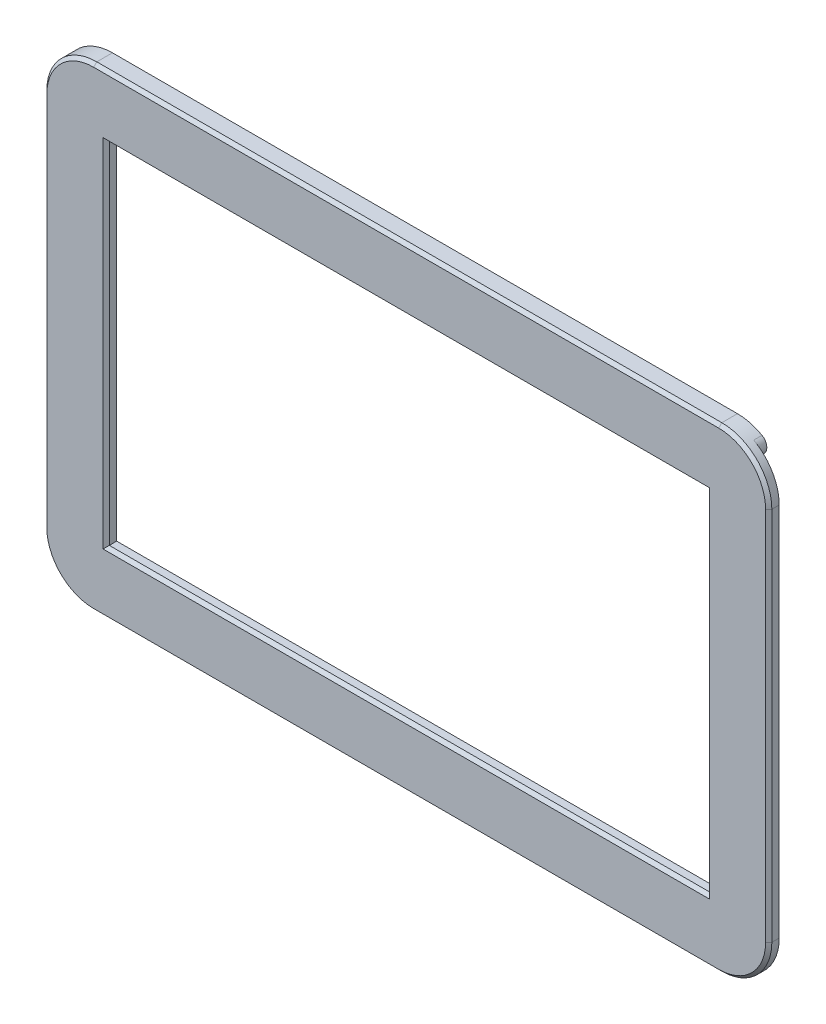
ISO-10303-21;
HEADER;
FILE_DESCRIPTION(('STEP AP214'),'2;1');
FILE_NAME('part.step','',(''),(''),'','','');
FILE_SCHEMA(('AUTOMOTIVE_DESIGN { 1 0 10303 214 1 1 1 1 }'));
ENDSEC;
DATA;
#1=APPLICATION_CONTEXT('core data for automotive mechanical design processes');
#2=APPLICATION_PROTOCOL_DEFINITION('international standard','automotive_design',2000,#1);
#3=PRODUCT_CONTEXT('',#1,'mechanical');
#4=PRODUCT('Part','Part','',(#3));
#5=PRODUCT_RELATED_PRODUCT_CATEGORY('part','',(#4));
#6=PRODUCT_DEFINITION_FORMATION('','',#4);
#7=PRODUCT_DEFINITION_CONTEXT('part definition',#1,'design');
#8=PRODUCT_DEFINITION('design','',#6,#7);
#9=PRODUCT_DEFINITION_SHAPE('','',#8);
#10=(LENGTH_UNIT() NAMED_UNIT(*) SI_UNIT(.MILLI.,.METRE.));
#11=(NAMED_UNIT(*) PLANE_ANGLE_UNIT() SI_UNIT($,.RADIAN.));
#12=(NAMED_UNIT(*) SI_UNIT($,.STERADIAN.) SOLID_ANGLE_UNIT());
#13=UNCERTAINTY_MEASURE_WITH_UNIT(LENGTH_MEASURE(1.E-05),#10,'distance_accuracy_value','');
#14=(GEOMETRIC_REPRESENTATION_CONTEXT(3) GLOBAL_UNCERTAINTY_ASSIGNED_CONTEXT((#13)) GLOBAL_UNIT_ASSIGNED_CONTEXT((#10,
#11,#12)) REPRESENTATION_CONTEXT('',''));
#15=CARTESIAN_POINT('',(0.,0.,0.));
#16=DIRECTION('',(0.,0.,1.));
#17=DIRECTION('',(1.,0.,0.));
#18=AXIS2_PLACEMENT_3D('',#15,#16,#17);
#19=CARTESIAN_POINT('',(39.6875,-23.8125,2.38125));
#20=DIRECTION('',(0.,0.,-1.));
#21=DIRECTION('',(-1.,0.,0.));
#22=AXIS2_PLACEMENT_3D('',#19,#20,#21);
#23=CYLINDRICAL_SURFACE('',#22,6.35);
#24=DIRECTION('',(0.,0.,-1.));
#25=VECTOR('',#24,1.);
#26=CARTESIAN_POINT('',(46.0375,-23.8125,2.38125));
#27=LINE('',#26,#25);
#28=CARTESIAN_POINT('',(46.0375,-23.8125,1.984375));
#29=VERTEX_POINT('',#28);
#30=CARTESIAN_POINT('',(46.0375,-23.8125,1.04775));
#31=VERTEX_POINT('',#30);
#32=EDGE_CURVE('E622',#29,#31,#27,.T.);
#33=ORIENTED_EDGE('',*,*,#32,.F.);
#34=CARTESIAN_POINT('',(39.6875,-23.8125,1.984375));
#35=DIRECTION('',(0.,0.,1.));
#36=DIRECTION('',(1.,0.,0.));
#37=AXIS2_PLACEMENT_3D('',#34,#35,#36);
#38=CIRCLE('',#37,6.35);
#39=CARTESIAN_POINT('',(39.6875,-30.1625,1.984375));
#40=VERTEX_POINT('',#39);
#41=EDGE_CURVE('E359',#29,#40,#38,.F.);
#42=ORIENTED_EDGE('',*,*,#41,.T.);
#43=DIRECTION('',(0.,0.,-1.));
#44=VECTOR('',#43,1.);
#45=CARTESIAN_POINT('',(39.6875,-30.1625,2.38125));
#46=LINE('',#45,#44);
#47=CARTESIAN_POINT('',(39.6875,-30.1625,0.));
#48=VERTEX_POINT('',#47);
#49=EDGE_CURVE('E625',#40,#48,#46,.T.);
#50=ORIENTED_EDGE('',*,*,#49,.T.);
#51=CARTESIAN_POINT('',(39.6875,-23.8125,0.));
#52=DIRECTION('',(0.,0.,1.));
#53=DIRECTION('',(0.,-1.,0.));
#54=AXIS2_PLACEMENT_3D('',#51,#52,#53);
#55=CIRCLE('',#54,6.35);
#56=CARTESIAN_POINT('',(42.8097437084808,-29.3418846153846,0.));
#57=VERTEX_POINT('',#56);
#58=EDGE_CURVE('E610',#48,#57,#55,.T.);
#59=ORIENTED_EDGE('',*,*,#58,.T.);
#60=DIRECTION('',(0.,0.,-1.));
#61=VECTOR('',#60,1.);
#62=CARTESIAN_POINT('',(42.8097437084808,-29.3418846153846,2.38125));
#63=LINE('',#62,#61);
#64=CARTESIAN_POINT('',(42.8097437084808,-29.3418846153846,1.04775));
#65=VERTEX_POINT('',#64);
#66=EDGE_CURVE('E293',#57,#65,#63,.F.);
#67=ORIENTED_EDGE('',*,*,#66,.T.);
#68=CARTESIAN_POINT('',(39.6875,-23.8125,1.04775));
#69=DIRECTION('',(0.,0.,-1.));
#70=DIRECTION('',(-1.,0.,0.));
#71=AXIS2_PLACEMENT_3D('',#68,#69,#70);
#72=CIRCLE('',#71,6.35);
#73=EDGE_CURVE('E590',#31,#65,#72,.T.);
#74=ORIENTED_EDGE('',*,*,#73,.F.);
#75=EDGE_LOOP('',(#33,#42,#50,#59,#67,#74));
#76=FACE_BOUND('',#75,.T.);
#77=ADVANCED_FACE('F16',(#76),#23,.T.);
#78=CARTESIAN_POINT('',(39.6875,23.8125,2.38125));
#79=DIRECTION('',(0.,0.,-1.));
#80=DIRECTION('',(-1.,0.,0.));
#81=AXIS2_PLACEMENT_3D('',#78,#79,#80);
#82=CYLINDRICAL_SURFACE('',#81,6.35);
#83=DIRECTION('',(0.,0.,-1.));
#84=VECTOR('',#83,1.);
#85=CARTESIAN_POINT('',(39.6875,30.1625,2.38125));
#86=LINE('',#85,#84);
#87=CARTESIAN_POINT('',(39.6875,30.1625,1.984375));
#88=VERTEX_POINT('',#87);
#89=CARTESIAN_POINT('',(39.6875,30.1625,0.));
#90=VERTEX_POINT('',#89);
#91=EDGE_CURVE('E618',#88,#90,#86,.T.);
#92=ORIENTED_EDGE('',*,*,#91,.F.);
#93=CARTESIAN_POINT('',(39.6875,23.8125,1.984375));
#94=DIRECTION('',(0.,0.,1.));
#95=DIRECTION('',(1.,0.,0.));
#96=AXIS2_PLACEMENT_3D('',#93,#94,#95);
#97=CIRCLE('',#96,6.35);
#98=CARTESIAN_POINT('',(46.0375,23.8125,1.984375));
#99=VERTEX_POINT('',#98);
#100=EDGE_CURVE('E10',#88,#99,#97,.F.);
#101=ORIENTED_EDGE('',*,*,#100,.T.);
#102=DIRECTION('',(0.,0.,-1.));
#103=VECTOR('',#102,1.);
#104=CARTESIAN_POINT('',(46.0375,23.8125,2.38125));
#105=LINE('',#104,#103);
#106=CARTESIAN_POINT('',(46.0375,23.8125,1.04775));
#107=VERTEX_POINT('',#106);
#108=EDGE_CURVE('E620',#99,#107,#105,.T.);
#109=ORIENTED_EDGE('',*,*,#108,.T.);
#110=CARTESIAN_POINT('',(39.6875,23.8125,1.04775));
#111=DIRECTION('',(0.,0.,-1.));
#112=DIRECTION('',(-1.,0.,0.));
#113=AXIS2_PLACEMENT_3D('',#110,#111,#112);
#114=CIRCLE('',#113,6.35);
#115=CARTESIAN_POINT('',(42.8097437084808,29.3418846153846,1.04775));
#116=VERTEX_POINT('',#115);
#117=EDGE_CURVE('E506',#116,#107,#114,.T.);
#118=ORIENTED_EDGE('',*,*,#117,.F.);
#119=DIRECTION('',(0.,0.,-1.));
#120=VECTOR('',#119,1.);
#121=CARTESIAN_POINT('',(42.8097437084808,29.3418846153846,2.38125));
#122=LINE('',#121,#120);
#123=CARTESIAN_POINT('',(42.8097437084808,29.3418846153846,0.));
#124=VERTEX_POINT('',#123);
#125=EDGE_CURVE('E297',#116,#124,#122,.T.);
#126=ORIENTED_EDGE('',*,*,#125,.T.);
#127=CARTESIAN_POINT('',(39.6875,23.8125,0.));
#128=DIRECTION('',(0.,0.,1.));
#129=DIRECTION('',(1.,0.,0.));
#130=AXIS2_PLACEMENT_3D('',#127,#128,#129);
#131=CIRCLE('',#130,6.35);
#132=EDGE_CURVE('E614',#124,#90,#131,.T.);
#133=ORIENTED_EDGE('',*,*,#132,.T.);
#134=EDGE_LOOP('',(#92,#101,#109,#118,#126,#133));
#135=FACE_BOUND('',#134,.T.);
#136=ADVANCED_FACE('F643',(#135),#82,.T.);
#137=CARTESIAN_POINT('',(18.2190250813962,30.1625,2.38125));
#138=DIRECTION('',(0.,1.,0.));
#139=DIRECTION('',(-1.,0.,0.));
#140=AXIS2_PLACEMENT_3D('',#137,#138,#139);
#141=PLANE('',#140);
#142=DIRECTION('',(0.,0.,-1.));
#143=VECTOR('',#142,1.);
#144=CARTESIAN_POINT('',(-39.6875,30.1625,2.38125));
#145=LINE('',#144,#143);
#146=CARTESIAN_POINT('',(-39.6875,30.1625,1.984375));
#147=VERTEX_POINT('',#146);
#148=CARTESIAN_POINT('',(-39.6875,30.1625,0.));
#149=VERTEX_POINT('',#148);
#150=EDGE_CURVE('E496',#147,#149,#145,.T.);
#151=ORIENTED_EDGE('',*,*,#150,.F.);
#152=DIRECTION('',(1.,0.,0.));
#153=VECTOR('',#152,1.);
#154=CARTESIAN_POINT('',(18.2190250813962,30.1625,1.984375));
#155=LINE('',#154,#153);
#156=EDGE_CURVE('E368',#147,#88,#155,.T.);
#157=ORIENTED_EDGE('',*,*,#156,.T.);
#158=ORIENTED_EDGE('',*,*,#91,.T.);
#159=DIRECTION('',(1.,0.,0.));
#160=VECTOR('',#159,1.);
#161=CARTESIAN_POINT('',(18.2190250813962,30.1625,0.));
#162=LINE('',#161,#160);
#163=EDGE_CURVE('E504',#149,#90,#162,.T.);
#164=ORIENTED_EDGE('',*,*,#163,.F.);
#165=EDGE_LOOP('',(#151,#157,#158,#164));
#166=FACE_BOUND('',#165,.T.);
#167=ADVANCED_FACE('F501',(#166),#141,.T.);
#168=CARTESIAN_POINT('',(-39.6875,23.8125,2.38125));
#169=DIRECTION('',(0.,0.,-1.));
#170=DIRECTION('',(-1.,0.,0.));
#171=AXIS2_PLACEMENT_3D('',#168,#169,#170);
#172=CYLINDRICAL_SURFACE('',#171,6.35);
#173=DIRECTION('',(0.,0.,-1.));
#174=VECTOR('',#173,1.);
#175=CARTESIAN_POINT('',(-46.0375,23.8125,2.38125));
#176=LINE('',#175,#174);
#177=CARTESIAN_POINT('',(-46.0375,23.8125,1.984375));
#178=VERTEX_POINT('',#177);
#179=CARTESIAN_POINT('',(-46.0375,23.8125,0.));
#180=VERTEX_POINT('',#179);
#181=EDGE_CURVE('E498',#178,#180,#176,.T.);
#182=ORIENTED_EDGE('',*,*,#181,.F.);
#183=CARTESIAN_POINT('',(-39.6875,23.8125,1.984375));
#184=DIRECTION('',(0.,0.,1.));
#185=DIRECTION('',(1.,0.,0.));
#186=AXIS2_PLACEMENT_3D('',#183,#184,#185);
#187=CIRCLE('',#186,6.35);
#188=EDGE_CURVE('E362',#178,#147,#187,.F.);
#189=ORIENTED_EDGE('',*,*,#188,.T.);
#190=ORIENTED_EDGE('',*,*,#150,.T.);
#191=CARTESIAN_POINT('',(-39.6875,23.8125,0.));
#192=DIRECTION('',(0.,0.,1.));
#193=DIRECTION('',(0.,1.,0.));
#194=AXIS2_PLACEMENT_3D('',#191,#192,#193);
#195=CIRCLE('',#194,6.35);
#196=EDGE_CURVE('E595',#149,#180,#195,.T.);
#197=ORIENTED_EDGE('',*,*,#196,.T.);
#198=EDGE_LOOP('',(#182,#189,#190,#197));
#199=FACE_BOUND('',#198,.T.);
#200=ADVANCED_FACE('F494',(#199),#172,.T.);
#201=CARTESIAN_POINT('',(-46.0375,-4.5061891585588,2.38125));
#202=DIRECTION('',(-1.,0.,0.));
#203=DIRECTION('',(0.,0.,1.));
#204=AXIS2_PLACEMENT_3D('',#201,#202,#203);
#205=PLANE('',#204);
#206=DIRECTION('',(0.,0.,-1.));
#207=VECTOR('',#206,1.);
#208=CARTESIAN_POINT('',(-46.0375,-23.8125,2.38125));
#209=LINE('',#208,#207);
#210=CARTESIAN_POINT('',(-46.0375,-23.8125,1.984375));
#211=VERTEX_POINT('',#210);
#212=CARTESIAN_POINT('',(-46.0375,-23.8125,0.));
#213=VERTEX_POINT('',#212);
#214=EDGE_CURVE('E516',#211,#213,#209,.T.);
#215=ORIENTED_EDGE('',*,*,#214,.F.);
#216=DIRECTION('',(0.,1.,0.));
#217=VECTOR('',#216,1.);
#218=CARTESIAN_POINT('',(-46.0375,-4.5061891585588,1.984375));
#219=LINE('',#218,#217);
#220=EDGE_CURVE('E356',#211,#178,#219,.T.);
#221=ORIENTED_EDGE('',*,*,#220,.T.);
#222=ORIENTED_EDGE('',*,*,#181,.T.);
#223=DIRECTION('',(0.,1.,0.));
#224=VECTOR('',#223,1.);
#225=CARTESIAN_POINT('',(-46.0375,-4.5061891585588,0.));
#226=LINE('',#225,#224);
#227=EDGE_CURVE('E598',#213,#180,#226,.T.);
#228=ORIENTED_EDGE('',*,*,#227,.F.);
#229=EDGE_LOOP('',(#215,#221,#222,#228));
#230=FACE_BOUND('',#229,.T.);
#231=ADVANCED_FACE('F640',(#230),#205,.T.);
#232=CARTESIAN_POINT('',(-39.6875,-23.8125,2.38125));
#233=DIRECTION('',(0.,0.,-1.));
#234=DIRECTION('',(-1.,0.,0.));
#235=AXIS2_PLACEMENT_3D('',#232,#233,#234);
#236=CYLINDRICAL_SURFACE('',#235,6.35);
#237=DIRECTION('',(0.,0.,-1.));
#238=VECTOR('',#237,1.);
#239=CARTESIAN_POINT('',(-39.6875,-30.1625,2.38125));
#240=LINE('',#239,#238);
#241=CARTESIAN_POINT('',(-39.6875,-30.1625,1.984375));
#242=VERTEX_POINT('',#241);
#243=CARTESIAN_POINT('',(-39.6875,-30.1625,0.));
#244=VERTEX_POINT('',#243);
#245=EDGE_CURVE('E627',#242,#244,#240,.T.);
#246=ORIENTED_EDGE('',*,*,#245,.F.);
#247=CARTESIAN_POINT('',(-39.6875,-23.8125,1.984375));
#248=DIRECTION('',(0.,0.,1.));
#249=DIRECTION('',(1.,0.,0.));
#250=AXIS2_PLACEMENT_3D('',#247,#248,#249);
#251=CIRCLE('',#250,6.35);
#252=EDGE_CURVE('E349',#242,#211,#251,.F.);
#253=ORIENTED_EDGE('',*,*,#252,.T.);
#254=ORIENTED_EDGE('',*,*,#214,.T.);
#255=CARTESIAN_POINT('',(-39.6875,-23.8125,0.));
#256=DIRECTION('',(0.,0.,1.));
#257=DIRECTION('',(-1.,0.,0.));
#258=AXIS2_PLACEMENT_3D('',#255,#256,#257);
#259=CIRCLE('',#258,6.35);
#260=EDGE_CURVE('E602',#213,#244,#259,.T.);
#261=ORIENTED_EDGE('',*,*,#260,.T.);
#262=EDGE_LOOP('',(#246,#253,#254,#261));
#263=FACE_BOUND('',#262,.T.);
#264=ADVANCED_FACE('F635',(#263),#236,.T.);
#265=CARTESIAN_POINT('',(29.5328173995018,-30.1625,2.38125));
#266=DIRECTION('',(0.,1.,0.));
#267=DIRECTION('',(-1.,0.,0.));
#268=AXIS2_PLACEMENT_3D('',#265,#266,#267);
#269=PLANE('',#268);
#270=ORIENTED_EDGE('',*,*,#49,.F.);
#271=DIRECTION('',(-1.,0.,0.));
#272=VECTOR('',#271,1.);
#273=CARTESIAN_POINT('',(-39.6875,-30.1625,1.984375));
#274=LINE('',#273,#272);
#275=EDGE_CURVE('E353',#40,#242,#274,.T.);
#276=ORIENTED_EDGE('',*,*,#275,.T.);
#277=ORIENTED_EDGE('',*,*,#245,.T.);
#278=DIRECTION('',(1.,0.,0.));
#279=VECTOR('',#278,1.);
#280=CARTESIAN_POINT('',(29.5328173995018,-30.1625,0.));
#281=LINE('',#280,#279);
#282=EDGE_CURVE('E606',#244,#48,#281,.T.);
#283=ORIENTED_EDGE('',*,*,#282,.T.);
#284=EDGE_LOOP('',(#270,#276,#277,#283));
#285=FACE_BOUND('',#284,.T.);
#286=ADVANCED_FACE('F685',(#285),#269,.F.);
#287=CARTESIAN_POINT('',(46.0375,-10.6636528104544,2.38125));
#288=DIRECTION('',(-1.,0.,0.));
#289=DIRECTION('',(0.,0.,1.));
#290=AXIS2_PLACEMENT_3D('',#287,#288,#289);
#291=PLANE('',#290);
#292=ORIENTED_EDGE('',*,*,#108,.F.);
#293=DIRECTION('',(0.,-1.,0.));
#294=VECTOR('',#293,1.);
#295=CARTESIAN_POINT('',(46.0375,-23.8125,1.984375));
#296=LINE('',#295,#294);
#297=EDGE_CURVE('E365',#99,#29,#296,.T.);
#298=ORIENTED_EDGE('',*,*,#297,.T.);
#299=ORIENTED_EDGE('',*,*,#32,.T.);
#300=DIRECTION('',(0.,1.,0.));
#301=VECTOR('',#300,1.);
#302=CARTESIAN_POINT('',(46.0375,0.182570958540846,1.04775));
#303=LINE('',#302,#301);
#304=EDGE_CURVE('E583',#31,#107,#303,.T.);
#305=ORIENTED_EDGE('',*,*,#304,.T.);
#306=EDGE_LOOP('',(#292,#298,#299,#305));
#307=FACE_BOUND('',#306,.T.);
#308=ADVANCED_FACE('F449',(#307),#291,.F.);
#309=CARTESIAN_POINT('',(0.,0.,2.38125));
#310=DIRECTION('',(0.,0.,1.));
#311=DIRECTION('',(1.,0.,0.));
#312=AXIS2_PLACEMENT_3D('',#309,#310,#311);
#313=PLANE('',#312);
#314=DIRECTION('',(-1.,0.,0.));
#315=VECTOR('',#314,1.);
#316=CARTESIAN_POINT('',(0.,-22.621875,2.38125));
#317=LINE('',#316,#315);
#318=CARTESIAN_POINT('',(38.496875,-22.621875,2.38125));
#319=VERTEX_POINT('',#318);
#320=CARTESIAN_POINT('',(-38.496875,-22.621875,2.38125));
#321=VERTEX_POINT('',#320);
#322=EDGE_CURVE('E342',#319,#321,#317,.T.);
#323=ORIENTED_EDGE('',*,*,#322,.T.);
#324=DIRECTION('',(0.,1.,0.));
#325=VECTOR('',#324,1.);
#326=CARTESIAN_POINT('',(-38.496875,0.,2.38125));
#327=LINE('',#326,#325);
#328=CARTESIAN_POINT('',(-38.496875,22.621875,2.38125));
#329=VERTEX_POINT('',#328);
#330=EDGE_CURVE('E345',#321,#329,#327,.T.);
#331=ORIENTED_EDGE('',*,*,#330,.T.);
#332=DIRECTION('',(1.,0.,0.));
#333=VECTOR('',#332,1.);
#334=CARTESIAN_POINT('',(38.1,22.621875,2.38125));
#335=LINE('',#334,#333);
#336=CARTESIAN_POINT('',(38.496875,22.621875,2.38125));
#337=VERTEX_POINT('',#336);
#338=EDGE_CURVE('E339',#329,#337,#335,.T.);
#339=ORIENTED_EDGE('',*,*,#338,.T.);
#340=DIRECTION('',(0.,-1.,0.));
#341=VECTOR('',#340,1.);
#342=CARTESIAN_POINT('',(38.496875,-22.225,2.38125));
#343=LINE('',#342,#341);
#344=EDGE_CURVE('E336',#337,#319,#343,.T.);
#345=ORIENTED_EDGE('',*,*,#344,.T.);
#346=EDGE_LOOP('',(#323,#331,#339,#345));
#347=FACE_BOUND('',#346,.T.);
#348=DIRECTION('',(0.,-1.,0.));
#349=VECTOR('',#348,1.);
#350=CARTESIAN_POINT('',(-45.640625,0.,2.38125));
#351=LINE('',#350,#349);
#352=CARTESIAN_POINT('',(-45.640625,23.8125,2.38125));
#353=VERTEX_POINT('',#352);
#354=CARTESIAN_POINT('',(-45.640625,-23.8125,2.38125));
#355=VERTEX_POINT('',#354);
#356=EDGE_CURVE('E326',#353,#355,#351,.T.);
#357=ORIENTED_EDGE('',*,*,#356,.T.);
#358=CARTESIAN_POINT('',(-39.6875,-23.8125,2.38125));
#359=DIRECTION('',(0.,0.,1.));
#360=DIRECTION('',(1.,0.,0.));
#361=AXIS2_PLACEMENT_3D('',#358,#359,#360);
#362=CIRCLE('',#361,5.953125);
#363=CARTESIAN_POINT('',(-39.6875,-29.765625,2.38125));
#364=VERTEX_POINT('',#363);
#365=EDGE_CURVE('E332',#355,#364,#362,.T.);
#366=ORIENTED_EDGE('',*,*,#365,.T.);
#367=DIRECTION('',(1.,0.,0.));
#368=VECTOR('',#367,1.);
#369=CARTESIAN_POINT('',(39.6875,-29.765625,2.38125));
#370=LINE('',#369,#368);
#371=CARTESIAN_POINT('',(39.6875,-29.765625,2.38125));
#372=VERTEX_POINT('',#371);
#373=EDGE_CURVE('E329',#364,#372,#370,.T.);
#374=ORIENTED_EDGE('',*,*,#373,.T.);
#375=CARTESIAN_POINT('',(39.6875,-23.8125,2.38125));
#376=DIRECTION('',(0.,0.,1.));
#377=DIRECTION('',(1.,0.,0.));
#378=AXIS2_PLACEMENT_3D('',#375,#376,#377);
#379=CIRCLE('',#378,5.953125);
#380=CARTESIAN_POINT('',(45.640625,-23.8125,2.38125));
#381=VERTEX_POINT('',#380);
#382=EDGE_CURVE('E323',#372,#381,#379,.T.);
#383=ORIENTED_EDGE('',*,*,#382,.T.);
#384=DIRECTION('',(0.,1.,0.));
#385=VECTOR('',#384,1.);
#386=CARTESIAN_POINT('',(45.640625,23.8125,2.38125));
#387=LINE('',#386,#385);
#388=CARTESIAN_POINT('',(45.640625,23.8125,2.38125));
#389=VERTEX_POINT('',#388);
#390=EDGE_CURVE('E317',#381,#389,#387,.T.);
#391=ORIENTED_EDGE('',*,*,#390,.T.);
#392=CARTESIAN_POINT('',(39.6875,23.8125,2.38125));
#393=DIRECTION('',(0.,0.,1.));
#394=DIRECTION('',(1.,0.,0.));
#395=AXIS2_PLACEMENT_3D('',#392,#393,#394);
#396=CIRCLE('',#395,5.953125);
#397=CARTESIAN_POINT('',(39.6875,29.765625,2.38125));
#398=VERTEX_POINT('',#397);
#399=EDGE_CURVE('E311',#389,#398,#396,.T.);
#400=ORIENTED_EDGE('',*,*,#399,.T.);
#401=DIRECTION('',(-1.,0.,0.));
#402=VECTOR('',#401,1.);
#403=CARTESIAN_POINT('',(0.,29.765625,2.38125));
#404=LINE('',#403,#402);
#405=CARTESIAN_POINT('',(-39.6875,29.765625,2.38125));
#406=VERTEX_POINT('',#405);
#407=EDGE_CURVE('E314',#398,#406,#404,.T.);
#408=ORIENTED_EDGE('',*,*,#407,.T.);
#409=CARTESIAN_POINT('',(-39.6875,23.8125,2.38125));
#410=DIRECTION('',(0.,0.,1.));
#411=DIRECTION('',(1.,0.,0.));
#412=AXIS2_PLACEMENT_3D('',#409,#410,#411);
#413=CIRCLE('',#412,5.953125);
#414=EDGE_CURVE('E320',#406,#353,#413,.T.);
#415=ORIENTED_EDGE('',*,*,#414,.T.);
#416=EDGE_LOOP('',(#357,#366,#374,#383,#391,#400,#408,#415));
#417=FACE_BOUND('',#416,.T.);
#418=ADVANCED_FACE('F445',(#347,#417),#313,.T.);
#419=CARTESIAN_POINT('',(0.,0.,0.));
#420=DIRECTION('',(0.,0.,1.));
#421=DIRECTION('',(1.,0.,0.));
#422=AXIS2_PLACEMENT_3D('',#419,#420,#421);
#423=PLANE('',#422);
#424=DIRECTION('',(1.,0.,0.));
#425=VECTOR('',#424,1.);
#426=CARTESIAN_POINT('',(-42.9895,-27.1145,0.));
#427=LINE('',#426,#425);
#428=CARTESIAN_POINT('',(-40.60825,-27.1145,0.));
#429=VERTEX_POINT('',#428);
#430=CARTESIAN_POINT('',(42.2243230131406,-27.1145,0.));
#431=VERTEX_POINT('',#430);
#432=EDGE_CURVE('E580',#429,#431,#427,.T.);
#433=ORIENTED_EDGE('',*,*,#432,.T.);
#434=CARTESIAN_POINT('',(42.2243230131406,-28.305125,0.));
#435=DIRECTION('',(0.,0.,1.));
#436=DIRECTION('',(1.,0.,0.));
#437=AXIS2_PLACEMENT_3D('',#434,#435,#436);
#438=CIRCLE('',#437,1.190625);
#439=EDGE_CURVE('E290',#431,#57,#438,.F.);
#440=ORIENTED_EDGE('',*,*,#439,.T.);
#441=ORIENTED_EDGE('',*,*,#58,.F.);
#442=ORIENTED_EDGE('',*,*,#282,.F.);
#443=ORIENTED_EDGE('',*,*,#260,.F.);
#444=ORIENTED_EDGE('',*,*,#227,.T.);
#445=ORIENTED_EDGE('',*,*,#196,.F.);
#446=ORIENTED_EDGE('',*,*,#163,.T.);
#447=ORIENTED_EDGE('',*,*,#132,.F.);
#448=CARTESIAN_POINT('',(42.2243230131406,28.305125,0.));
#449=DIRECTION('',(0.,0.,1.));
#450=DIRECTION('',(1.,0.,0.));
#451=AXIS2_PLACEMENT_3D('',#448,#449,#450);
#452=CIRCLE('',#451,1.190625);
#453=CARTESIAN_POINT('',(42.2243230131406,27.1145,0.));
#454=VERTEX_POINT('',#453);
#455=EDGE_CURVE('E287',#124,#454,#452,.F.);
#456=ORIENTED_EDGE('',*,*,#455,.T.);
#457=DIRECTION('',(1.,0.,0.));
#458=VECTOR('',#457,1.);
#459=CARTESIAN_POINT('',(-42.9895,27.1145,0.));
#460=LINE('',#459,#458);
#461=CARTESIAN_POINT('',(-40.60825,27.1145,0.));
#462=VERTEX_POINT('',#461);
#463=EDGE_CURVE('E553',#462,#454,#460,.T.);
#464=ORIENTED_EDGE('',*,*,#463,.F.);
#465=CARTESIAN_POINT('',(-40.60825,24.73325,0.));
#466=DIRECTION('',(0.,0.,1.));
#467=DIRECTION('',(1.,0.,0.));
#468=AXIS2_PLACEMENT_3D('',#465,#466,#467);
#469=CIRCLE('',#468,2.38125);
#470=CARTESIAN_POINT('',(-42.9895,24.73325,0.));
#471=VERTEX_POINT('',#470);
#472=EDGE_CURVE('E257',#462,#471,#469,.T.);
#473=ORIENTED_EDGE('',*,*,#472,.T.);
#474=DIRECTION('',(0.,1.,0.));
#475=VECTOR('',#474,1.);
#476=CARTESIAN_POINT('',(-42.9895,0.103227657108473,0.));
#477=LINE('',#476,#475);
#478=CARTESIAN_POINT('',(-42.9895,-24.73325,0.));
#479=VERTEX_POINT('',#478);
#480=EDGE_CURVE('E550',#479,#471,#477,.T.);
#481=ORIENTED_EDGE('',*,*,#480,.F.);
#482=CARTESIAN_POINT('',(-40.60825,-24.73325,0.));
#483=DIRECTION('',(0.,0.,1.));
#484=DIRECTION('',(1.,0.,0.));
#485=AXIS2_PLACEMENT_3D('',#482,#483,#484);
#486=CIRCLE('',#485,2.38125);
#487=EDGE_CURVE('E539',#479,#429,#486,.T.);
#488=ORIENTED_EDGE('',*,*,#487,.T.);
#489=EDGE_LOOP('',(#433,#440,#441,#442,#443,#444,#445,#446,#447,#456,#464,#473,#481,#488));
#490=FACE_BOUND('',#489,.T.);
#491=ADVANCED_FACE('F448',(#490),#423,.F.);
#492=CARTESIAN_POINT('',(-42.9895,0.182570958540846,1.04775));
#493=DIRECTION('',(0.,0.,-1.));
#494=DIRECTION('',(-1.,0.,0.));
#495=AXIS2_PLACEMENT_3D('',#492,#493,#494);
#496=PLANE('',#495);
#497=DIRECTION('',(0.,-1.,0.));
#498=VECTOR('',#497,1.);
#499=CARTESIAN_POINT('',(38.1,0.182570958540826,1.04775));
#500=LINE('',#499,#498);
#501=CARTESIAN_POINT('',(38.1,22.225,1.04775));
#502=VERTEX_POINT('',#501);
#503=CARTESIAN_POINT('',(38.1,-22.225,1.04775));
#504=VERTEX_POINT('',#503);
#505=EDGE_CURVE('E278',#502,#504,#500,.T.);
#506=ORIENTED_EDGE('',*,*,#505,.F.);
#507=DIRECTION('',(1.,0.,0.));
#508=VECTOR('',#507,1.);
#509=CARTESIAN_POINT('',(-42.9895,22.225,1.04775));
#510=LINE('',#509,#508);
#511=CARTESIAN_POINT('',(-38.1,22.225,1.04775));
#512=VERTEX_POINT('',#511);
#513=EDGE_CURVE('E272',#512,#502,#510,.T.);
#514=ORIENTED_EDGE('',*,*,#513,.F.);
#515=DIRECTION('',(0.,-1.,0.));
#516=VECTOR('',#515,1.);
#517=CARTESIAN_POINT('',(-38.1,0.182570958540844,1.04775));
#518=LINE('',#517,#516);
#519=CARTESIAN_POINT('',(-38.1,-22.225,1.04775));
#520=VERTEX_POINT('',#519);
#521=EDGE_CURVE('E256',#512,#520,#518,.T.);
#522=ORIENTED_EDGE('',*,*,#521,.T.);
#523=DIRECTION('',(1.,0.,0.));
#524=VECTOR('',#523,1.);
#525=CARTESIAN_POINT('',(-42.9895,-22.225,1.04775));
#526=LINE('',#525,#524);
#527=EDGE_CURVE('E246',#520,#504,#526,.T.);
#528=ORIENTED_EDGE('',*,*,#527,.T.);
#529=EDGE_LOOP('',(#506,#514,#522,#528));
#530=FACE_BOUND('',#529,.T.);
#531=DIRECTION('',(1.,0.,0.));
#532=VECTOR('',#531,1.);
#533=CARTESIAN_POINT('',(-42.9895,-27.1145,1.04775));
#534=LINE('',#533,#532);
#535=CARTESIAN_POINT('',(-40.60825,-27.1145,1.04775));
#536=VERTEX_POINT('',#535);
#537=CARTESIAN_POINT('',(42.2243230131406,-27.1145,1.04775));
#538=VERTEX_POINT('',#537);
#539=EDGE_CURVE('E587',#536,#538,#534,.T.);
#540=ORIENTED_EDGE('',*,*,#539,.F.);
#541=CARTESIAN_POINT('',(-40.60825,-24.73325,1.04775));
#542=DIRECTION('',(0.,0.,-1.));
#543=DIRECTION('',(-1.,0.,0.));
#544=AXIS2_PLACEMENT_3D('',#541,#542,#543);
#545=CIRCLE('',#544,2.38125);
#546=CARTESIAN_POINT('',(-42.9895,-24.73325,1.04775));
#547=VERTEX_POINT('',#546);
#548=EDGE_CURVE('E526',#536,#547,#545,.T.);
#549=ORIENTED_EDGE('',*,*,#548,.T.);
#550=DIRECTION('',(0.,1.,0.));
#551=VECTOR('',#550,1.);
#552=CARTESIAN_POINT('',(-42.9895,0.182570958540846,1.04775));
#553=LINE('',#552,#551);
#554=CARTESIAN_POINT('',(-42.9895,24.73325,1.04775));
#555=VERTEX_POINT('',#554);
#556=EDGE_CURVE('E564',#547,#555,#553,.T.);
#557=ORIENTED_EDGE('',*,*,#556,.T.);
#558=CARTESIAN_POINT('',(-40.60825,24.73325,1.04775));
#559=DIRECTION('',(0.,0.,-1.));
#560=DIRECTION('',(-1.,0.,0.));
#561=AXIS2_PLACEMENT_3D('',#558,#559,#560);
#562=CIRCLE('',#561,2.38125);
#563=CARTESIAN_POINT('',(-40.60825,27.1145,1.04775));
#564=VERTEX_POINT('',#563);
#565=EDGE_CURVE('E523',#555,#564,#562,.T.);
#566=ORIENTED_EDGE('',*,*,#565,.T.);
#567=DIRECTION('',(1.,0.,0.));
#568=VECTOR('',#567,1.);
#569=CARTESIAN_POINT('',(-42.9895,27.1145,1.04775));
#570=LINE('',#569,#568);
#571=CARTESIAN_POINT('',(42.2243230131406,27.1145,1.04775));
#572=VERTEX_POINT('',#571);
#573=EDGE_CURVE('E563',#564,#572,#570,.T.);
#574=ORIENTED_EDGE('',*,*,#573,.T.);
#575=CARTESIAN_POINT('',(42.2243230131406,28.305125,1.04775));
#576=DIRECTION('',(0.,0.,-1.));
#577=DIRECTION('',(-1.,0.,0.));
#578=AXIS2_PLACEMENT_3D('',#575,#576,#577);
#579=CIRCLE('',#578,1.190625);
#580=EDGE_CURVE('E307',#572,#116,#579,.F.);
#581=ORIENTED_EDGE('',*,*,#580,.T.);
#582=ORIENTED_EDGE('',*,*,#117,.T.);
#583=ORIENTED_EDGE('',*,*,#304,.F.);
#584=ORIENTED_EDGE('',*,*,#73,.T.);
#585=CARTESIAN_POINT('',(42.2243230131406,-28.305125,1.04775));
#586=DIRECTION('',(0.,0.,-1.));
#587=DIRECTION('',(-1.,0.,0.));
#588=AXIS2_PLACEMENT_3D('',#585,#586,#587);
#589=CIRCLE('',#588,1.190625);
#590=EDGE_CURVE('E304',#65,#538,#589,.F.);
#591=ORIENTED_EDGE('',*,*,#590,.T.);
#592=EDGE_LOOP('',(#540,#549,#557,#566,#574,#581,#582,#583,#584,#591));
#593=FACE_BOUND('',#592,.T.);
#594=ADVANCED_FACE('F270',(#530,#593),#496,.T.);
#595=CARTESIAN_POINT('',(-42.9895,-27.1145,0.424327699005377));
#596=DIRECTION('',(0.,1.,0.));
#597=DIRECTION('',(0.,0.,1.));
#598=AXIS2_PLACEMENT_3D('',#595,#596,#597);
#599=PLANE('',#598);
#600=ORIENTED_EDGE('',*,*,#539,.T.);
#601=DIRECTION('',(0.,0.,1.));
#602=VECTOR('',#601,1.);
#603=CARTESIAN_POINT('',(42.2243230131406,-27.1145,0.));
#604=LINE('',#603,#602);
#605=EDGE_CURVE('E283',#538,#431,#604,.F.);
#606=ORIENTED_EDGE('',*,*,#605,.T.);
#607=ORIENTED_EDGE('',*,*,#432,.F.);
#608=DIRECTION('',(0.,0.,1.));
#609=VECTOR('',#608,1.);
#610=CARTESIAN_POINT('',(-40.60825,-27.1145,1.04775));
#611=LINE('',#610,#609);
#612=EDGE_CURVE('E513',#429,#536,#611,.T.);
#613=ORIENTED_EDGE('',*,*,#612,.T.);
#614=EDGE_LOOP('',(#600,#606,#607,#613));
#615=FACE_BOUND('',#614,.T.);
#616=ADVANCED_FACE('F822',(#615),#599,.T.);
#617=CARTESIAN_POINT('',(-42.9895,27.1145,0.424327699005378));
#618=DIRECTION('',(0.,1.,0.));
#619=DIRECTION('',(0.,0.,1.));
#620=AXIS2_PLACEMENT_3D('',#617,#618,#619);
#621=PLANE('',#620);
#622=ORIENTED_EDGE('',*,*,#463,.T.);
#623=DIRECTION('',(0.,0.,-1.));
#624=VECTOR('',#623,1.);
#625=CARTESIAN_POINT('',(42.2243230131406,27.1145,0.424327699005378));
#626=LINE('',#625,#624);
#627=EDGE_CURVE('E301',#454,#572,#626,.F.);
#628=ORIENTED_EDGE('',*,*,#627,.T.);
#629=ORIENTED_EDGE('',*,*,#573,.F.);
#630=DIRECTION('',(0.,0.,1.));
#631=VECTOR('',#630,1.);
#632=CARTESIAN_POINT('',(-40.60825,27.1145,0.424327699005378));
#633=LINE('',#632,#631);
#634=EDGE_CURVE('E536',#564,#462,#633,.F.);
#635=ORIENTED_EDGE('',*,*,#634,.T.);
#636=EDGE_LOOP('',(#622,#628,#629,#635));
#637=FACE_BOUND('',#636,.T.);
#638=ADVANCED_FACE('F572',(#637),#621,.F.);
#639=CARTESIAN_POINT('',(-42.9895,0.,1.190625));
#640=DIRECTION('',(1.,0.,0.));
#641=DIRECTION('',(0.,1.,0.));
#642=AXIS2_PLACEMENT_3D('',#639,#640,#641);
#643=PLANE('',#642);
#644=ORIENTED_EDGE('',*,*,#556,.F.);
#645=DIRECTION('',(0.,0.,1.));
#646=VECTOR('',#645,1.);
#647=CARTESIAN_POINT('',(-42.9895,-24.73325,0.));
#648=LINE('',#647,#646);
#649=EDGE_CURVE('E533',#547,#479,#648,.F.);
#650=ORIENTED_EDGE('',*,*,#649,.T.);
#651=ORIENTED_EDGE('',*,*,#480,.T.);
#652=DIRECTION('',(0.,0.,1.));
#653=VECTOR('',#652,1.);
#654=CARTESIAN_POINT('',(-42.9895,24.73325,1.190625));
#655=LINE('',#654,#653);
#656=EDGE_CURVE('E529',#471,#555,#655,.T.);
#657=ORIENTED_EDGE('',*,*,#656,.T.);
#658=EDGE_LOOP('',(#644,#650,#651,#657));
#659=FACE_BOUND('',#658,.T.);
#660=ADVANCED_FACE('F559',(#659),#643,.T.);
#661=CARTESIAN_POINT('',(-40.60825,-24.73325,0.424327699005376));
#662=DIRECTION('',(0.,0.,-1.));
#663=DIRECTION('',(0.,1.,0.));
#664=AXIS2_PLACEMENT_3D('',#661,#662,#663);
#665=CYLINDRICAL_SURFACE('',#664,2.38125);
#666=ORIENTED_EDGE('',*,*,#487,.F.);
#667=ORIENTED_EDGE('',*,*,#649,.F.);
#668=ORIENTED_EDGE('',*,*,#548,.F.);
#669=ORIENTED_EDGE('',*,*,#612,.F.);
#670=EDGE_LOOP('',(#666,#667,#668,#669));
#671=FACE_BOUND('',#670,.T.);
#672=ADVANCED_FACE('F673',(#671),#665,.F.);
#673=CARTESIAN_POINT('',(-40.60825,24.73325,1.190625));
#674=DIRECTION('',(0.,0.,1.));
#675=DIRECTION('',(0.,-1.,0.));
#676=AXIS2_PLACEMENT_3D('',#673,#674,#675);
#677=CYLINDRICAL_SURFACE('',#676,2.38125);
#678=ORIENTED_EDGE('',*,*,#472,.F.);
#679=ORIENTED_EDGE('',*,*,#634,.F.);
#680=ORIENTED_EDGE('',*,*,#565,.F.);
#681=ORIENTED_EDGE('',*,*,#656,.F.);
#682=EDGE_LOOP('',(#678,#679,#680,#681));
#683=FACE_BOUND('',#682,.T.);
#684=ADVANCED_FACE('F566',(#683),#677,.F.);
#685=CARTESIAN_POINT('',(38.1,8.9789819987662,-107.731345798476));
#686=DIRECTION('',(1.,0.,0.));
#687=DIRECTION('',(0.,1.,0.));
#688=AXIS2_PLACEMENT_3D('',#685,#686,#687);
#689=PLANE('',#688);
#690=DIRECTION('',(0.,0.,1.));
#691=VECTOR('',#690,1.);
#692=CARTESIAN_POINT('',(38.1,-22.225,-107.731345798476));
#693=LINE('',#692,#691);
#694=CARTESIAN_POINT('',(38.1,-22.225,1.984375));
#695=VERTEX_POINT('',#694);
#696=EDGE_CURVE('E250',#504,#695,#693,.T.);
#697=ORIENTED_EDGE('',*,*,#696,.T.);
#698=DIRECTION('',(0.,1.,0.));
#699=VECTOR('',#698,1.);
#700=CARTESIAN_POINT('',(38.1,22.225,1.984375));
#701=LINE('',#700,#699);
#702=CARTESIAN_POINT('',(38.1,22.225,1.984375));
#703=VERTEX_POINT('',#702);
#704=EDGE_CURVE('E26',#695,#703,#701,.T.);
#705=ORIENTED_EDGE('',*,*,#704,.T.);
#706=DIRECTION('',(0.,0.,1.));
#707=VECTOR('',#706,1.);
#708=CARTESIAN_POINT('',(38.1,22.225,-107.731345798476));
#709=LINE('',#708,#707);
#710=EDGE_CURVE('E438',#502,#703,#709,.T.);
#711=ORIENTED_EDGE('',*,*,#710,.F.);
#712=ORIENTED_EDGE('',*,*,#505,.T.);
#713=EDGE_LOOP('',(#697,#705,#711,#712));
#714=FACE_BOUND('',#713,.T.);
#715=ADVANCED_FACE('F664',(#714),#689,.F.);
#716=CARTESIAN_POINT('',(-3.175,22.225,-107.731345798476));
#717=DIRECTION('',(0.,1.,0.));
#718=DIRECTION('',(-1.,0.,0.));
#719=AXIS2_PLACEMENT_3D('',#716,#717,#718);
#720=PLANE('',#719);
#721=ORIENTED_EDGE('',*,*,#710,.T.);
#722=DIRECTION('',(-1.,0.,0.));
#723=VECTOR('',#722,1.);
#724=CARTESIAN_POINT('',(-38.1,22.225,1.984375));
#725=LINE('',#724,#723);
#726=CARTESIAN_POINT('',(-38.1,22.225,1.984375));
#727=VERTEX_POINT('',#726);
#728=EDGE_CURVE('E375',#703,#727,#725,.T.);
#729=ORIENTED_EDGE('',*,*,#728,.T.);
#730=DIRECTION('',(0.,0.,1.));
#731=VECTOR('',#730,1.);
#732=CARTESIAN_POINT('',(-38.1,22.225,-107.731345798476));
#733=LINE('',#732,#731);
#734=EDGE_CURVE('E267',#512,#727,#733,.T.);
#735=ORIENTED_EDGE('',*,*,#734,.F.);
#736=ORIENTED_EDGE('',*,*,#513,.T.);
#737=EDGE_LOOP('',(#721,#729,#735,#736));
#738=FACE_BOUND('',#737,.T.);
#739=ADVANCED_FACE('F437',(#738),#720,.F.);
#740=CARTESIAN_POINT('',(-38.1,-6.53403692591728,-107.731345798476));
#741=DIRECTION('',(1.,0.,0.));
#742=DIRECTION('',(0.,1.,0.));
#743=AXIS2_PLACEMENT_3D('',#740,#741,#742);
#744=PLANE('',#743);
#745=ORIENTED_EDGE('',*,*,#734,.T.);
#746=DIRECTION('',(0.,-1.,0.));
#747=VECTOR('',#746,1.);
#748=CARTESIAN_POINT('',(-38.1,-6.53403692591728,1.984375));
#749=LINE('',#748,#747);
#750=CARTESIAN_POINT('',(-38.1,-22.225,1.984375));
#751=VERTEX_POINT('',#750);
#752=EDGE_CURVE('E265',#727,#751,#749,.T.);
#753=ORIENTED_EDGE('',*,*,#752,.T.);
#754=DIRECTION('',(0.,0.,1.));
#755=VECTOR('',#754,1.);
#756=CARTESIAN_POINT('',(-38.1,-22.225,-107.731345798476));
#757=LINE('',#756,#755);
#758=EDGE_CURVE('E249',#520,#751,#757,.T.);
#759=ORIENTED_EDGE('',*,*,#758,.F.);
#760=ORIENTED_EDGE('',*,*,#521,.F.);
#761=EDGE_LOOP('',(#745,#753,#759,#760));
#762=FACE_BOUND('',#761,.T.);
#763=ADVANCED_FACE('F262',(#762),#744,.T.);
#764=CARTESIAN_POINT('',(-3.27489115742849,-22.225,-107.731345798476));
#765=DIRECTION('',(0.,1.,0.));
#766=DIRECTION('',(-1.,0.,0.));
#767=AXIS2_PLACEMENT_3D('',#764,#765,#766);
#768=PLANE('',#767);
#769=ORIENTED_EDGE('',*,*,#758,.T.);
#770=DIRECTION('',(1.,0.,0.));
#771=VECTOR('',#770,1.);
#772=CARTESIAN_POINT('',(-3.27489115742849,-22.225,1.984375));
#773=LINE('',#772,#771);
#774=EDGE_CURVE('E50',#751,#695,#773,.T.);
#775=ORIENTED_EDGE('',*,*,#774,.T.);
#776=ORIENTED_EDGE('',*,*,#696,.F.);
#777=ORIENTED_EDGE('',*,*,#527,.F.);
#778=EDGE_LOOP('',(#769,#775,#776,#777));
#779=FACE_BOUND('',#778,.T.);
#780=ADVANCED_FACE('F248',(#779),#768,.T.);
#781=CARTESIAN_POINT('',(42.2243230131406,-28.305125,2.38125));
#782=DIRECTION('',(0.,0.,-1.));
#783=DIRECTION('',(-1.,0.,0.));
#784=AXIS2_PLACEMENT_3D('',#781,#782,#783);
#785=CYLINDRICAL_SURFACE('',#784,1.190625);
#786=ORIENTED_EDGE('',*,*,#590,.F.);
#787=ORIENTED_EDGE('',*,*,#66,.F.);
#788=ORIENTED_EDGE('',*,*,#439,.F.);
#789=ORIENTED_EDGE('',*,*,#605,.F.);
#790=EDGE_LOOP('',(#786,#787,#788,#789));
#791=FACE_BOUND('',#790,.T.);
#792=ADVANCED_FACE('F700',(#791),#785,.T.);
#793=CARTESIAN_POINT('',(42.2243230131406,28.305125,2.38125));
#794=DIRECTION('',(0.,0.,-1.));
#795=DIRECTION('',(-1.,0.,0.));
#796=AXIS2_PLACEMENT_3D('',#793,#794,#795);
#797=CYLINDRICAL_SURFACE('',#796,1.190625);
#798=ORIENTED_EDGE('',*,*,#580,.F.);
#799=ORIENTED_EDGE('',*,*,#627,.F.);
#800=ORIENTED_EDGE('',*,*,#455,.F.);
#801=ORIENTED_EDGE('',*,*,#125,.F.);
#802=EDGE_LOOP('',(#798,#799,#800,#801));
#803=FACE_BOUND('',#802,.T.);
#804=ADVANCED_FACE('F646',(#803),#797,.T.);
#805=CARTESIAN_POINT('',(39.6875,23.8125,2.38125));
#806=DIRECTION('',(0.,0.,-1.));
#807=DIRECTION('',(-1.,0.,0.));
#808=AXIS2_PLACEMENT_3D('',#805,#806,#807);
#809=CONICAL_SURFACE('',#808,5.953125,0.78539816339745);
#810=DIRECTION('',(-0.707106781186546,0.,0.70710678118655));
#811=VECTOR('',#810,1.);
#812=CARTESIAN_POINT('',(46.0375,23.8125,1.984375));
#813=LINE('',#812,#811);
#814=EDGE_CURVE('E402',#99,#389,#813,.T.);
#815=ORIENTED_EDGE('',*,*,#814,.F.);
#816=ORIENTED_EDGE('',*,*,#100,.F.);
#817=DIRECTION('',(0.,0.707106781186549,-0.707106781186546));
#818=VECTOR('',#817,1.);
#819=CARTESIAN_POINT('',(39.6875,29.765625,2.38125));
#820=LINE('',#819,#818);
#821=EDGE_CURVE('E406',#398,#88,#820,.T.);
#822=ORIENTED_EDGE('',*,*,#821,.F.);
#823=ORIENTED_EDGE('',*,*,#399,.F.);
#824=EDGE_LOOP('',(#815,#816,#822,#823));
#825=FACE_BOUND('',#824,.T.);
#826=ADVANCED_FACE('F481',(#825),#809,.T.);
#827=CARTESIAN_POINT('',(18.2190250813962,30.1625,1.984375));
#828=DIRECTION('',(0.,-0.707106781186547,-0.707106781186549));
#829=DIRECTION('',(1.,0.,0.));
#830=AXIS2_PLACEMENT_3D('',#827,#828,#829);
#831=PLANE('',#830);
#832=ORIENTED_EDGE('',*,*,#821,.T.);
#833=ORIENTED_EDGE('',*,*,#156,.F.);
#834=DIRECTION('',(0.,0.707106781186549,-0.707106781186546));
#835=VECTOR('',#834,1.);
#836=CARTESIAN_POINT('',(-39.6875,29.765625,2.38125));
#837=LINE('',#836,#835);
#838=EDGE_CURVE('E398',#406,#147,#837,.T.);
#839=ORIENTED_EDGE('',*,*,#838,.F.);
#840=ORIENTED_EDGE('',*,*,#407,.F.);
#841=EDGE_LOOP('',(#832,#833,#839,#840));
#842=FACE_BOUND('',#841,.T.);
#843=ADVANCED_FACE('F487',(#842),#831,.F.);
#844=CARTESIAN_POINT('',(45.640625,0.,2.38125));
#845=DIRECTION('',(0.70710678118655,0.,0.707106781186546));
#846=DIRECTION('',(0.,-1.,0.));
#847=AXIS2_PLACEMENT_3D('',#844,#845,#846);
#848=PLANE('',#847);
#849=ORIENTED_EDGE('',*,*,#814,.T.);
#850=ORIENTED_EDGE('',*,*,#390,.F.);
#851=DIRECTION('',(-0.707106781186546,0.,0.70710678118655));
#852=VECTOR('',#851,1.);
#853=CARTESIAN_POINT('',(46.0375,-23.8125,1.984375));
#854=LINE('',#853,#852);
#855=EDGE_CURVE('E394',#29,#381,#854,.T.);
#856=ORIENTED_EDGE('',*,*,#855,.F.);
#857=ORIENTED_EDGE('',*,*,#297,.F.);
#858=EDGE_LOOP('',(#849,#850,#856,#857));
#859=FACE_BOUND('',#858,.T.);
#860=ADVANCED_FACE('F476',(#859),#848,.T.);
#861=CARTESIAN_POINT('',(-39.6875,23.8125,2.38125));
#862=DIRECTION('',(0.,0.,-1.));
#863=DIRECTION('',(-1.,0.,0.));
#864=AXIS2_PLACEMENT_3D('',#861,#862,#863);
#865=CONICAL_SURFACE('',#864,5.953125,0.78539816339745);
#866=ORIENTED_EDGE('',*,*,#838,.T.);
#867=ORIENTED_EDGE('',*,*,#188,.F.);
#868=DIRECTION('',(-0.707106781186546,0.,-0.70710678118655));
#869=VECTOR('',#868,1.);
#870=CARTESIAN_POINT('',(-45.640625,23.8125,2.38125));
#871=LINE('',#870,#869);
#872=EDGE_CURVE('E390',#353,#178,#871,.T.);
#873=ORIENTED_EDGE('',*,*,#872,.F.);
#874=ORIENTED_EDGE('',*,*,#414,.F.);
#875=EDGE_LOOP('',(#866,#867,#873,#874));
#876=FACE_BOUND('',#875,.T.);
#877=ADVANCED_FACE('F490',(#876),#865,.T.);
#878=CARTESIAN_POINT('',(39.6875,-23.8125,2.38125));
#879=DIRECTION('',(0.,0.,-1.));
#880=DIRECTION('',(-1.,0.,0.));
#881=AXIS2_PLACEMENT_3D('',#878,#879,#880);
#882=CONICAL_SURFACE('',#881,5.953125,0.785398163397446);
#883=ORIENTED_EDGE('',*,*,#855,.T.);
#884=ORIENTED_EDGE('',*,*,#382,.F.);
#885=DIRECTION('',(0.,0.707106781186546,0.70710678118655));
#886=VECTOR('',#885,1.);
#887=CARTESIAN_POINT('',(39.6875,-30.1625,1.984375));
#888=LINE('',#887,#886);
#889=EDGE_CURVE('E386',#40,#372,#888,.T.);
#890=ORIENTED_EDGE('',*,*,#889,.F.);
#891=ORIENTED_EDGE('',*,*,#41,.F.);
#892=EDGE_LOOP('',(#883,#884,#890,#891));
#893=FACE_BOUND('',#892,.T.);
#894=ADVANCED_FACE('F471',(#893),#882,.T.);
#895=CARTESIAN_POINT('',(-46.0375,-4.5061891585588,1.984375));
#896=DIRECTION('',(0.70710678118655,0.,-0.707106781186546));
#897=DIRECTION('',(0.,1.,0.));
#898=AXIS2_PLACEMENT_3D('',#895,#896,#897);
#899=PLANE('',#898);
#900=ORIENTED_EDGE('',*,*,#872,.T.);
#901=ORIENTED_EDGE('',*,*,#220,.F.);
#902=DIRECTION('',(-0.707106781186546,0.,-0.70710678118655));
#903=VECTOR('',#902,1.);
#904=CARTESIAN_POINT('',(-45.640625,-23.8125,2.38125));
#905=LINE('',#904,#903);
#906=EDGE_CURVE('E383',#355,#211,#905,.T.);
#907=ORIENTED_EDGE('',*,*,#906,.F.);
#908=ORIENTED_EDGE('',*,*,#356,.F.);
#909=EDGE_LOOP('',(#900,#901,#907,#908));
#910=FACE_BOUND('',#909,.T.);
#911=ADVANCED_FACE('F458',(#910),#899,.F.);
#912=CARTESIAN_POINT('',(0.,-29.765625,2.38125));
#913=DIRECTION('',(0.,-0.707106781186545,0.70710678118655));
#914=DIRECTION('',(-1.,0.,0.));
#915=AXIS2_PLACEMENT_3D('',#912,#913,#914);
#916=PLANE('',#915);
#917=ORIENTED_EDGE('',*,*,#889,.T.);
#918=ORIENTED_EDGE('',*,*,#373,.F.);
#919=DIRECTION('',(0.,0.707106781186549,0.707106781186546));
#920=VECTOR('',#919,1.);
#921=CARTESIAN_POINT('',(-39.6875,-30.1625,1.984375));
#922=LINE('',#921,#920);
#923=EDGE_CURVE('E380',#242,#364,#922,.T.);
#924=ORIENTED_EDGE('',*,*,#923,.F.);
#925=ORIENTED_EDGE('',*,*,#275,.F.);
#926=EDGE_LOOP('',(#917,#918,#924,#925));
#927=FACE_BOUND('',#926,.T.);
#928=ADVANCED_FACE('F466',(#927),#916,.T.);
#929=CARTESIAN_POINT('',(-39.6875,-23.8125,2.38125));
#930=DIRECTION('',(0.,0.,-1.));
#931=DIRECTION('',(-1.,0.,0.));
#932=AXIS2_PLACEMENT_3D('',#929,#930,#931);
#933=CONICAL_SURFACE('',#932,5.953125,0.78539816339745);
#934=ORIENTED_EDGE('',*,*,#906,.T.);
#935=ORIENTED_EDGE('',*,*,#252,.F.);
#936=ORIENTED_EDGE('',*,*,#923,.T.);
#937=ORIENTED_EDGE('',*,*,#365,.F.);
#938=EDGE_LOOP('',(#934,#935,#936,#937));
#939=FACE_BOUND('',#938,.T.);
#940=ADVANCED_FACE('F461',(#939),#933,.T.);
#941=CARTESIAN_POINT('',(38.1,8.9789819987662,1.984375));
#942=DIRECTION('',(-0.707106781186551,0.,0.707106781186545));
#943=DIRECTION('',(0.,-1.,0.));
#944=AXIS2_PLACEMENT_3D('',#941,#942,#943);
#945=PLANE('',#944);
#946=DIRECTION('',(-0.577350269189623,-0.577350269189626,-0.577350269189628));
#947=VECTOR('',#946,1.);
#948=CARTESIAN_POINT('',(24.3416666666668,8.46666666666671,-11.7739583333333));
#949=LINE('',#948,#947);
#950=EDGE_CURVE('E415',#703,#337,#949,.F.);
#951=ORIENTED_EDGE('',*,*,#950,.F.);
#952=ORIENTED_EDGE('',*,*,#704,.F.);
#953=DIRECTION('',(-0.577350269189624,0.577350269189625,-0.577350269189629));
#954=VECTOR('',#953,1.);
#955=CARTESIAN_POINT('',(25.6645833333334,-9.78958333333341,-10.4510416666667));
#956=LINE('',#955,#954);
#957=EDGE_CURVE('E20',#319,#695,#956,.T.);
#958=ORIENTED_EDGE('',*,*,#957,.F.);
#959=ORIENTED_EDGE('',*,*,#344,.F.);
#960=EDGE_LOOP('',(#951,#952,#958,#959));
#961=FACE_BOUND('',#960,.T.);
#962=ADVANCED_FACE('F18',(#961),#945,.T.);
#963=CARTESIAN_POINT('',(0.,-22.621875,2.38125));
#964=DIRECTION('',(0.,-0.70710678118655,-0.707106781186545));
#965=DIRECTION('',(-1.,0.,0.));
#966=AXIS2_PLACEMENT_3D('',#963,#964,#965);
#967=PLANE('',#966);
#968=ORIENTED_EDGE('',*,*,#957,.T.);
#969=ORIENTED_EDGE('',*,*,#774,.F.);
#970=DIRECTION('',(-0.577350269189624,-0.577350269189625,0.577350269189629));
#971=VECTOR('',#970,1.);
#972=CARTESIAN_POINT('',(-30.95625,-15.08125,-5.159375));
#973=LINE('',#972,#971);
#974=EDGE_CURVE('E413',#321,#751,#973,.F.);
#975=ORIENTED_EDGE('',*,*,#974,.F.);
#976=ORIENTED_EDGE('',*,*,#322,.F.);
#977=EDGE_LOOP('',(#968,#969,#975,#976));
#978=FACE_BOUND('',#977,.T.);
#979=ADVANCED_FACE('F430',(#978),#967,.F.);
#980=CARTESIAN_POINT('',(-3.175,22.225,1.984375));
#981=DIRECTION('',(0.,-0.707106781186549,0.707106781186547));
#982=DIRECTION('',(1.,0.,0.));
#983=AXIS2_PLACEMENT_3D('',#980,#981,#982);
#984=PLANE('',#983);
#985=ORIENTED_EDGE('',*,*,#950,.T.);
#986=ORIENTED_EDGE('',*,*,#338,.F.);
#987=DIRECTION('',(-0.577350269189622,0.577350269189627,0.577350269189628));
#988=VECTOR('',#987,1.);
#989=CARTESIAN_POINT('',(-30.95625,15.08125,-5.159375));
#990=LINE('',#989,#988);
#991=EDGE_CURVE('E410',#727,#329,#990,.T.);
#992=ORIENTED_EDGE('',*,*,#991,.F.);
#993=ORIENTED_EDGE('',*,*,#728,.F.);
#994=EDGE_LOOP('',(#985,#986,#992,#993));
#995=FACE_BOUND('',#994,.T.);
#996=ADVANCED_FACE('F435',(#995),#984,.T.);
#997=CARTESIAN_POINT('',(-38.496875,0.,2.38125));
#998=DIRECTION('',(-0.707106781186551,0.,-0.707106781186544));
#999=DIRECTION('',(0.,1.,0.));
#1000=AXIS2_PLACEMENT_3D('',#997,#998,#999);
#1001=PLANE('',#1000);
#1002=ORIENTED_EDGE('',*,*,#974,.T.);
#1003=ORIENTED_EDGE('',*,*,#752,.F.);
#1004=ORIENTED_EDGE('',*,*,#991,.T.);
#1005=ORIENTED_EDGE('',*,*,#330,.F.);
#1006=EDGE_LOOP('',(#1002,#1003,#1004,#1005));
#1007=FACE_BOUND('',#1006,.T.);
#1008=ADVANCED_FACE('F442',(#1007),#1001,.F.);
#1009=CLOSED_SHELL('',(#77,#136,#167,#200,#231,#264,#286,#308,#418,#491,#594,#616,#638,#660,
#672,#684,#715,#739,#763,#780,#792,#804,#826,#843,#860,#877,#894,#911,#928,#940,#962,#979,#996,#1008));
#1010=MANIFOLD_SOLID_BREP('B1',#1009);
#1011=ADVANCED_BREP_SHAPE_REPRESENTATION('',(#18,#1010),#14);
#1012=SHAPE_DEFINITION_REPRESENTATION(#9,#1011);
ENDSEC;
END-ISO-10303-21;
